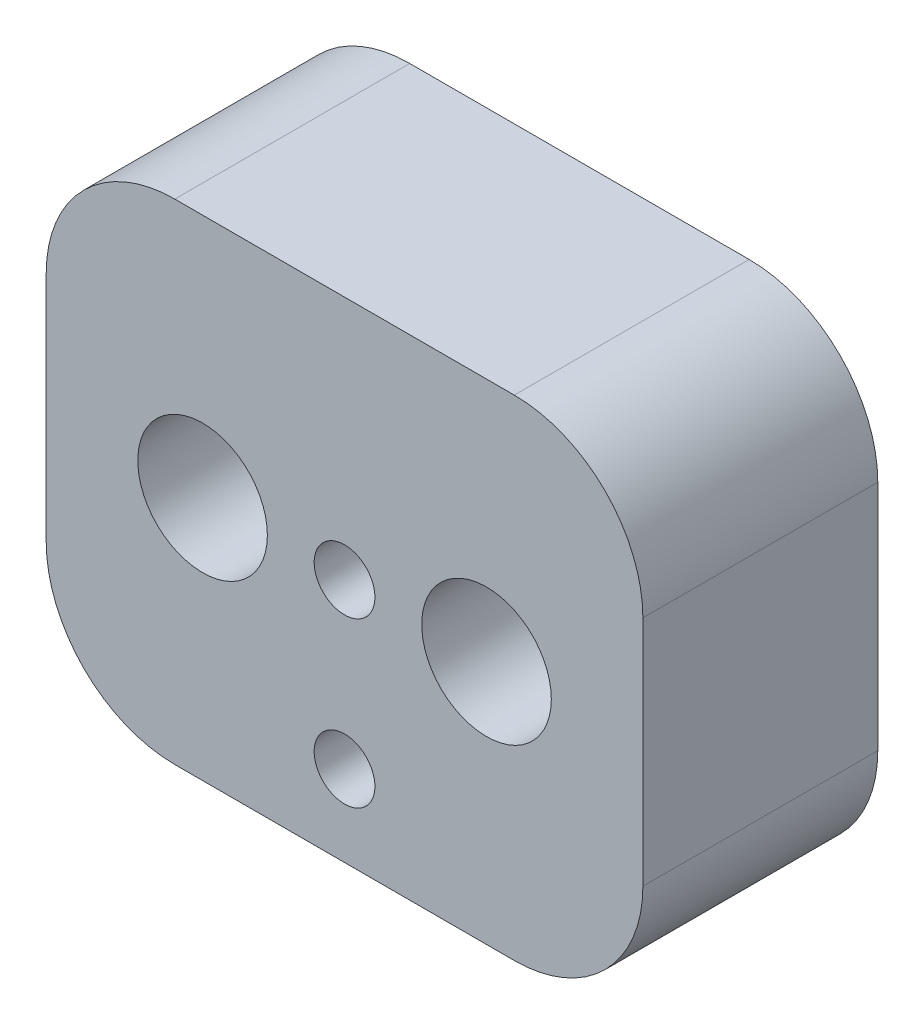
ISO-10303-21;
HEADER;
FILE_DESCRIPTION(('STEP AP214'),'2;1');
FILE_NAME('part.step','',(''),(''),'','','');
FILE_SCHEMA(('AUTOMOTIVE_DESIGN { 1 0 10303 214 1 1 1 1 }'));
ENDSEC;
DATA;
#1=APPLICATION_CONTEXT('core data for automotive mechanical design processes');
#2=APPLICATION_PROTOCOL_DEFINITION('international standard','automotive_design',2000,#1);
#3=PRODUCT_CONTEXT('',#1,'mechanical');
#4=PRODUCT('Part','Part','',(#3));
#5=PRODUCT_RELATED_PRODUCT_CATEGORY('part','',(#4));
#6=PRODUCT_DEFINITION_FORMATION('','',#4);
#7=PRODUCT_DEFINITION_CONTEXT('part definition',#1,'design');
#8=PRODUCT_DEFINITION('design','',#6,#7);
#9=PRODUCT_DEFINITION_SHAPE('','',#8);
#10=(LENGTH_UNIT() NAMED_UNIT(*) SI_UNIT(.MILLI.,.METRE.));
#11=(NAMED_UNIT(*) PLANE_ANGLE_UNIT() SI_UNIT($,.RADIAN.));
#12=(NAMED_UNIT(*) SI_UNIT($,.STERADIAN.) SOLID_ANGLE_UNIT());
#13=UNCERTAINTY_MEASURE_WITH_UNIT(LENGTH_MEASURE(1.E-05),#10,'distance_accuracy_value','');
#14=(GEOMETRIC_REPRESENTATION_CONTEXT(3) GLOBAL_UNCERTAINTY_ASSIGNED_CONTEXT((#13)) GLOBAL_UNIT_ASSIGNED_CONTEXT((#10,
#11,#12)) REPRESENTATION_CONTEXT('',''));
#15=CARTESIAN_POINT('',(0.,0.,0.));
#16=DIRECTION('',(0.,0.,1.));
#17=DIRECTION('',(1.,0.,0.));
#18=AXIS2_PLACEMENT_3D('',#15,#16,#17);
#19=CARTESIAN_POINT('',(0.,0.,5.8));
#20=DIRECTION('',(1.,0.,0.));
#21=DIRECTION('',(0.,0.,-1.));
#22=AXIS2_PLACEMENT_3D('',#19,#20,#21);
#23=PLANE('',#22);
#24=DIRECTION('',(0.,-1.,0.));
#25=VECTOR('',#24,1.);
#26=CARTESIAN_POINT('',(0.,0.,0.));
#27=LINE('',#26,#25);
#28=CARTESIAN_POINT('',(0.,8.9154,0.));
#29=VERTEX_POINT('',#28);
#30=CARTESIAN_POINT('',(0.,3.175,0.));
#31=VERTEX_POINT('',#30);
#32=EDGE_CURVE('E125',#29,#31,#27,.T.);
#33=ORIENTED_EDGE('',*,*,#32,.T.);
#34=DIRECTION('',(0.,0.,-1.));
#35=VECTOR('',#34,1.);
#36=CARTESIAN_POINT('',(0.,3.175,5.8));
#37=LINE('',#36,#35);
#38=CARTESIAN_POINT('',(0.,3.175,5.8));
#39=VERTEX_POINT('',#38);
#40=EDGE_CURVE('E103',#31,#39,#37,.F.);
#41=ORIENTED_EDGE('',*,*,#40,.T.);
#42=DIRECTION('',(0.,-1.,0.));
#43=VECTOR('',#42,1.);
#44=CARTESIAN_POINT('',(0.,0.,5.8));
#45=LINE('',#44,#43);
#46=CARTESIAN_POINT('',(0.,8.9154,5.8));
#47=VERTEX_POINT('',#46);
#48=EDGE_CURVE('E135',#47,#39,#45,.T.);
#49=ORIENTED_EDGE('',*,*,#48,.F.);
#50=DIRECTION('',(0.,0.,-1.));
#51=VECTOR('',#50,1.);
#52=CARTESIAN_POINT('',(0.,8.9154,5.8));
#53=LINE('',#52,#51);
#54=EDGE_CURVE('E108',#47,#29,#53,.T.);
#55=ORIENTED_EDGE('',*,*,#54,.T.);
#56=EDGE_LOOP('',(#33,#41,#49,#55));
#57=FACE_BOUND('',#56,.T.);
#58=ADVANCED_FACE('F32',(#57),#23,.F.);
#59=CARTESIAN_POINT('',(0.,0.,5.8));
#60=DIRECTION('',(0.,1.,0.));
#61=DIRECTION('',(0.,0.,1.));
#62=AXIS2_PLACEMENT_3D('',#59,#60,#61);
#63=PLANE('',#62);
#64=DIRECTION('',(1.,0.,0.));
#65=VECTOR('',#64,1.);
#66=CARTESIAN_POINT('',(0.,0.,5.8));
#67=LINE('',#66,#65);
#68=CARTESIAN_POINT('',(3.175,0.,5.8));
#69=VERTEX_POINT('',#68);
#70=CARTESIAN_POINT('',(11.557,0.,5.8));
#71=VERTEX_POINT('',#70);
#72=EDGE_CURVE('E118',#69,#71,#67,.T.);
#73=ORIENTED_EDGE('',*,*,#72,.F.);
#74=DIRECTION('',(0.,0.,-1.));
#75=VECTOR('',#74,1.);
#76=CARTESIAN_POINT('',(3.175,0.,5.8));
#77=LINE('',#76,#75);
#78=CARTESIAN_POINT('',(3.175,0.,0.));
#79=VERTEX_POINT('',#78);
#80=EDGE_CURVE('E102',#69,#79,#77,.T.);
#81=ORIENTED_EDGE('',*,*,#80,.T.);
#82=DIRECTION('',(1.,0.,0.));
#83=VECTOR('',#82,1.);
#84=CARTESIAN_POINT('',(0.,0.,0.));
#85=LINE('',#84,#83);
#86=CARTESIAN_POINT('',(11.557,0.,0.));
#87=VERTEX_POINT('',#86);
#88=EDGE_CURVE('E115',#79,#87,#85,.T.);
#89=ORIENTED_EDGE('',*,*,#88,.T.);
#90=DIRECTION('',(0.,0.,-1.));
#91=VECTOR('',#90,1.);
#92=CARTESIAN_POINT('',(11.557,0.,5.8));
#93=LINE('',#92,#91);
#94=EDGE_CURVE('E120',#87,#71,#93,.F.);
#95=ORIENTED_EDGE('',*,*,#94,.T.);
#96=EDGE_LOOP('',(#73,#81,#89,#95));
#97=FACE_BOUND('',#96,.T.);
#98=ADVANCED_FACE('F114',(#97),#63,.F.);
#99=CARTESIAN_POINT('',(14.732,0.,5.8));
#100=DIRECTION('',(-1.,0.,0.));
#101=DIRECTION('',(0.,-1.,0.));
#102=AXIS2_PLACEMENT_3D('',#99,#100,#101);
#103=PLANE('',#102);
#104=DIRECTION('',(0.,1.,0.));
#105=VECTOR('',#104,1.);
#106=CARTESIAN_POINT('',(14.732,0.,5.8));
#107=LINE('',#106,#105);
#108=CARTESIAN_POINT('',(14.732,3.175,5.8));
#109=VERTEX_POINT('',#108);
#110=CARTESIAN_POINT('',(14.732,8.9154,5.8));
#111=VERTEX_POINT('',#110);
#112=EDGE_CURVE('E170',#109,#111,#107,.T.);
#113=ORIENTED_EDGE('',*,*,#112,.F.);
#114=DIRECTION('',(0.,0.,-1.));
#115=VECTOR('',#114,1.);
#116=CARTESIAN_POINT('',(14.732,3.175,5.8));
#117=LINE('',#116,#115);
#118=CARTESIAN_POINT('',(14.732,3.175,0.));
#119=VERTEX_POINT('',#118);
#120=EDGE_CURVE('E163',#109,#119,#117,.T.);
#121=ORIENTED_EDGE('',*,*,#120,.T.);
#122=DIRECTION('',(0.,1.,0.));
#123=VECTOR('',#122,1.);
#124=CARTESIAN_POINT('',(14.732,0.,0.));
#125=LINE('',#124,#123);
#126=CARTESIAN_POINT('',(14.732,8.9154,0.));
#127=VERTEX_POINT('',#126);
#128=EDGE_CURVE('E124',#119,#127,#125,.T.);
#129=ORIENTED_EDGE('',*,*,#128,.T.);
#130=DIRECTION('',(0.,0.,-1.));
#131=VECTOR('',#130,1.);
#132=CARTESIAN_POINT('',(14.732,8.9154,5.8));
#133=LINE('',#132,#131);
#134=EDGE_CURVE('E161',#127,#111,#133,.F.);
#135=ORIENTED_EDGE('',*,*,#134,.T.);
#136=EDGE_LOOP('',(#113,#121,#129,#135));
#137=FACE_BOUND('',#136,.T.);
#138=ADVANCED_FACE('F168',(#137),#103,.F.);
#139=CARTESIAN_POINT('',(0.,12.0904,5.8));
#140=DIRECTION('',(0.,-1.,0.));
#141=DIRECTION('',(0.,0.,-1.));
#142=AXIS2_PLACEMENT_3D('',#139,#140,#141);
#143=PLANE('',#142);
#144=DIRECTION('',(-1.,0.,0.));
#145=VECTOR('',#144,1.);
#146=CARTESIAN_POINT('',(0.,12.0904,5.8));
#147=LINE('',#146,#145);
#148=CARTESIAN_POINT('',(11.557,12.0904,5.8));
#149=VERTEX_POINT('',#148);
#150=CARTESIAN_POINT('',(3.175,12.0904,5.8));
#151=VERTEX_POINT('',#150);
#152=EDGE_CURVE('E145',#149,#151,#147,.T.);
#153=ORIENTED_EDGE('',*,*,#152,.F.);
#154=DIRECTION('',(0.,0.,-1.));
#155=VECTOR('',#154,1.);
#156=CARTESIAN_POINT('',(11.557,12.0904,5.8));
#157=LINE('',#156,#155);
#158=CARTESIAN_POINT('',(11.557,12.0904,0.));
#159=VERTEX_POINT('',#158);
#160=EDGE_CURVE('E11',#149,#159,#157,.T.);
#161=ORIENTED_EDGE('',*,*,#160,.T.);
#162=DIRECTION('',(-1.,0.,0.));
#163=VECTOR('',#162,1.);
#164=CARTESIAN_POINT('',(0.,12.0904,0.));
#165=LINE('',#164,#163);
#166=CARTESIAN_POINT('',(3.175,12.0904,0.));
#167=VERTEX_POINT('',#166);
#168=EDGE_CURVE('E128',#159,#167,#165,.T.);
#169=ORIENTED_EDGE('',*,*,#168,.T.);
#170=DIRECTION('',(0.,0.,-1.));
#171=VECTOR('',#170,1.);
#172=CARTESIAN_POINT('',(3.175,12.0904,5.8));
#173=LINE('',#172,#171);
#174=EDGE_CURVE('E40',#167,#151,#173,.F.);
#175=ORIENTED_EDGE('',*,*,#174,.T.);
#176=EDGE_LOOP('',(#153,#161,#169,#175));
#177=FACE_BOUND('',#176,.T.);
#178=ADVANCED_FACE('F177',(#177),#143,.F.);
#179=CARTESIAN_POINT('',(0.,12.0904,5.8));
#180=DIRECTION('',(0.,0.,-1.));
#181=DIRECTION('',(-1.,0.,0.));
#182=AXIS2_PLACEMENT_3D('',#179,#180,#181);
#183=PLANE('',#182);
#184=CARTESIAN_POINT('',(3.8608,6.0452,5.8));
#185=DIRECTION('',(0.,0.,1.));
#186=DIRECTION('',(1.,0.,0.));
#187=AXIS2_PLACEMENT_3D('',#184,#185,#186);
#188=CIRCLE('',#187,1.59999999999999);
#189=CARTESIAN_POINT('',(5.46079999999999,6.0452,5.8));
#190=VERTEX_POINT('',#189);
#191=EDGE_CURVE('E144',#190,#190,#188,.T.);
#192=ORIENTED_EDGE('',*,*,#191,.F.);
#193=EDGE_LOOP('',(#192));
#194=FACE_BOUND('',#193,.T.);
#195=CARTESIAN_POINT('',(10.8712,6.0452,5.8));
#196=DIRECTION('',(0.,0.,1.));
#197=DIRECTION('',(1.,0.,0.));
#198=AXIS2_PLACEMENT_3D('',#195,#196,#197);
#199=CIRCLE('',#198,1.59999999999999);
#200=CARTESIAN_POINT('',(12.4712,6.0452,5.8));
#201=VERTEX_POINT('',#200);
#202=EDGE_CURVE('E140',#201,#201,#199,.T.);
#203=ORIENTED_EDGE('',*,*,#202,.F.);
#204=EDGE_LOOP('',(#203));
#205=FACE_BOUND('',#204,.T.);
#206=CARTESIAN_POINT('',(7.366,2.,5.8));
#207=DIRECTION('',(0.,0.,1.));
#208=DIRECTION('',(1.,0.,0.));
#209=AXIS2_PLACEMENT_3D('',#206,#207,#208);
#210=CIRCLE('',#209,0.749999999999999);
#211=CARTESIAN_POINT('',(8.116,2.,5.8));
#212=VERTEX_POINT('',#211);
#213=EDGE_CURVE('E139',#212,#212,#210,.T.);
#214=ORIENTED_EDGE('',*,*,#213,.F.);
#215=EDGE_LOOP('',(#214));
#216=FACE_BOUND('',#215,.T.);
#217=CARTESIAN_POINT('',(7.366,6.0452,5.8));
#218=DIRECTION('',(0.,0.,1.));
#219=DIRECTION('',(1.,0.,0.));
#220=AXIS2_PLACEMENT_3D('',#217,#218,#219);
#221=CIRCLE('',#220,0.749999999999998);
#222=CARTESIAN_POINT('',(8.11599999999999,6.0452,5.8));
#223=VERTEX_POINT('',#222);
#224=EDGE_CURVE('E184',#223,#223,#221,.T.);
#225=ORIENTED_EDGE('',*,*,#224,.F.);
#226=EDGE_LOOP('',(#225));
#227=FACE_BOUND('',#226,.T.);
#228=ORIENTED_EDGE('',*,*,#48,.T.);
#229=CARTESIAN_POINT('',(3.175,3.175,5.8));
#230=DIRECTION('',(0.,0.,-1.));
#231=DIRECTION('',(-1.,0.,0.));
#232=AXIS2_PLACEMENT_3D('',#229,#230,#231);
#233=CIRCLE('',#232,3.175);
#234=EDGE_CURVE('E159',#39,#69,#233,.F.);
#235=ORIENTED_EDGE('',*,*,#234,.T.);
#236=ORIENTED_EDGE('',*,*,#72,.T.);
#237=CARTESIAN_POINT('',(11.557,3.175,5.8));
#238=DIRECTION('',(0.,0.,-1.));
#239=DIRECTION('',(-1.,0.,0.));
#240=AXIS2_PLACEMENT_3D('',#237,#238,#239);
#241=CIRCLE('',#240,3.175);
#242=EDGE_CURVE('E157',#71,#109,#241,.F.);
#243=ORIENTED_EDGE('',*,*,#242,.T.);
#244=ORIENTED_EDGE('',*,*,#112,.T.);
#245=CARTESIAN_POINT('',(11.557,8.9154,5.8));
#246=DIRECTION('',(0.,0.,-1.));
#247=DIRECTION('',(-1.,0.,0.));
#248=AXIS2_PLACEMENT_3D('',#245,#246,#247);
#249=CIRCLE('',#248,3.175);
#250=EDGE_CURVE('E53',#111,#149,#249,.F.);
#251=ORIENTED_EDGE('',*,*,#250,.T.);
#252=ORIENTED_EDGE('',*,*,#152,.T.);
#253=CARTESIAN_POINT('',(3.175,8.9154,5.8));
#254=DIRECTION('',(0.,0.,-1.));
#255=DIRECTION('',(-1.,0.,0.));
#256=AXIS2_PLACEMENT_3D('',#253,#254,#255);
#257=CIRCLE('',#256,3.175);
#258=EDGE_CURVE('E154',#151,#47,#257,.F.);
#259=ORIENTED_EDGE('',*,*,#258,.T.);
#260=EDGE_LOOP('',(#228,#235,#236,#243,#244,#251,#252,#259));
#261=FACE_BOUND('',#260,.T.);
#262=ADVANCED_FACE('F201',(#194,#205,#216,#227,#261),#183,.F.);
#263=CARTESIAN_POINT('',(0.,12.0904,0.));
#264=DIRECTION('',(0.,0.,-1.));
#265=DIRECTION('',(-1.,0.,0.));
#266=AXIS2_PLACEMENT_3D('',#263,#264,#265);
#267=PLANE('',#266);
#268=CARTESIAN_POINT('',(3.8608,6.0452,0.));
#269=DIRECTION('',(0.,0.,-1.));
#270=DIRECTION('',(-1.,0.,0.));
#271=AXIS2_PLACEMENT_3D('',#268,#269,#270);
#272=CIRCLE('',#271,1.59999999999999);
#273=CARTESIAN_POINT('',(2.26080000000001,6.0452,0.));
#274=VERTEX_POINT('',#273);
#275=EDGE_CURVE('E141',#274,#274,#272,.T.);
#276=ORIENTED_EDGE('',*,*,#275,.F.);
#277=EDGE_LOOP('',(#276));
#278=FACE_BOUND('',#277,.T.);
#279=CARTESIAN_POINT('',(10.8712,6.0452,0.));
#280=DIRECTION('',(0.,0.,-1.));
#281=DIRECTION('',(-1.,0.,0.));
#282=AXIS2_PLACEMENT_3D('',#279,#280,#281);
#283=CIRCLE('',#282,1.59999999999999);
#284=CARTESIAN_POINT('',(9.27120000000001,6.0452,0.));
#285=VERTEX_POINT('',#284);
#286=EDGE_CURVE('E136',#285,#285,#283,.T.);
#287=ORIENTED_EDGE('',*,*,#286,.F.);
#288=EDGE_LOOP('',(#287));
#289=FACE_BOUND('',#288,.T.);
#290=CARTESIAN_POINT('',(7.366,2.,0.));
#291=DIRECTION('',(0.,0.,1.));
#292=DIRECTION('',(1.,0.,0.));
#293=AXIS2_PLACEMENT_3D('',#290,#291,#292);
#294=CIRCLE('',#293,0.749999999999999);
#295=CARTESIAN_POINT('',(8.116,2.,0.));
#296=VERTEX_POINT('',#295);
#297=EDGE_CURVE('E187',#296,#296,#294,.T.);
#298=ORIENTED_EDGE('',*,*,#297,.T.);
#299=EDGE_LOOP('',(#298));
#300=FACE_BOUND('',#299,.T.);
#301=CARTESIAN_POINT('',(7.366,6.0452,0.));
#302=DIRECTION('',(0.,0.,1.));
#303=DIRECTION('',(1.,0.,0.));
#304=AXIS2_PLACEMENT_3D('',#301,#302,#303);
#305=CIRCLE('',#304,0.749999999999998);
#306=CARTESIAN_POINT('',(8.11599999999999,6.0452,0.));
#307=VERTEX_POINT('',#306);
#308=EDGE_CURVE('E130',#307,#307,#305,.T.);
#309=ORIENTED_EDGE('',*,*,#308,.T.);
#310=EDGE_LOOP('',(#309));
#311=FACE_BOUND('',#310,.T.);
#312=ORIENTED_EDGE('',*,*,#88,.F.);
#313=CARTESIAN_POINT('',(3.175,3.175,0.));
#314=DIRECTION('',(0.,0.,-1.));
#315=DIRECTION('',(-1.,0.,0.));
#316=AXIS2_PLACEMENT_3D('',#313,#314,#315);
#317=CIRCLE('',#316,3.175);
#318=EDGE_CURVE('E98',#79,#31,#317,.T.);
#319=ORIENTED_EDGE('',*,*,#318,.T.);
#320=ORIENTED_EDGE('',*,*,#32,.F.);
#321=CARTESIAN_POINT('',(3.175,8.9154,0.));
#322=DIRECTION('',(0.,0.,-1.));
#323=DIRECTION('',(-1.,0.,0.));
#324=AXIS2_PLACEMENT_3D('',#321,#322,#323);
#325=CIRCLE('',#324,3.175);
#326=EDGE_CURVE('E119',#29,#167,#325,.T.);
#327=ORIENTED_EDGE('',*,*,#326,.T.);
#328=ORIENTED_EDGE('',*,*,#168,.F.);
#329=CARTESIAN_POINT('',(11.557,8.9154,0.));
#330=DIRECTION('',(0.,0.,-1.));
#331=DIRECTION('',(-1.,0.,0.));
#332=AXIS2_PLACEMENT_3D('',#329,#330,#331);
#333=CIRCLE('',#332,3.175);
#334=EDGE_CURVE('E148',#159,#127,#333,.T.);
#335=ORIENTED_EDGE('',*,*,#334,.T.);
#336=ORIENTED_EDGE('',*,*,#128,.F.);
#337=CARTESIAN_POINT('',(11.557,3.175,0.));
#338=DIRECTION('',(0.,0.,-1.));
#339=DIRECTION('',(-1.,0.,0.));
#340=AXIS2_PLACEMENT_3D('',#337,#338,#339);
#341=CIRCLE('',#340,3.175);
#342=EDGE_CURVE('E109',#119,#87,#341,.T.);
#343=ORIENTED_EDGE('',*,*,#342,.T.);
#344=EDGE_LOOP('',(#312,#319,#320,#327,#328,#335,#336,#343));
#345=FACE_BOUND('',#344,.T.);
#346=ADVANCED_FACE('F122',(#278,#289,#300,#311,#345),#267,.T.);
#347=CARTESIAN_POINT('',(7.366,6.0452,0.));
#348=DIRECTION('',(0.,0.,1.));
#349=DIRECTION('',(1.,0.,0.));
#350=AXIS2_PLACEMENT_3D('',#347,#348,#349);
#351=CYLINDRICAL_SURFACE('',#350,0.749999999999998);
#352=ORIENTED_EDGE('',*,*,#308,.F.);
#353=EDGE_LOOP('',(#352));
#354=FACE_BOUND('',#353,.T.);
#355=ORIENTED_EDGE('',*,*,#224,.T.);
#356=EDGE_LOOP('',(#355));
#357=FACE_BOUND('',#356,.T.);
#358=ADVANCED_FACE('F277',(#354,#357),#351,.F.);
#359=CARTESIAN_POINT('',(7.366,2.,0.));
#360=DIRECTION('',(0.,0.,1.));
#361=DIRECTION('',(1.,0.,0.));
#362=AXIS2_PLACEMENT_3D('',#359,#360,#361);
#363=CYLINDRICAL_SURFACE('',#362,0.749999999999999);
#364=ORIENTED_EDGE('',*,*,#297,.F.);
#365=EDGE_LOOP('',(#364));
#366=FACE_BOUND('',#365,.T.);
#367=ORIENTED_EDGE('',*,*,#213,.T.);
#368=EDGE_LOOP('',(#367));
#369=FACE_BOUND('',#368,.T.);
#370=ADVANCED_FACE('F268',(#366,#369),#363,.F.);
#371=CARTESIAN_POINT('',(10.8712,6.0452,5.8));
#372=DIRECTION('',(0.,0.,1.));
#373=DIRECTION('',(1.,0.,0.));
#374=AXIS2_PLACEMENT_3D('',#371,#372,#373);
#375=CYLINDRICAL_SURFACE('',#374,1.59999999999999);
#376=ORIENTED_EDGE('',*,*,#286,.T.);
#377=EDGE_LOOP('',(#376));
#378=FACE_BOUND('',#377,.T.);
#379=ORIENTED_EDGE('',*,*,#202,.T.);
#380=EDGE_LOOP('',(#379));
#381=FACE_BOUND('',#380,.T.);
#382=ADVANCED_FACE('F259',(#378,#381),#375,.F.);
#383=CARTESIAN_POINT('',(3.8608,6.0452,5.8));
#384=DIRECTION('',(0.,0.,1.));
#385=DIRECTION('',(1.,0.,0.));
#386=AXIS2_PLACEMENT_3D('',#383,#384,#385);
#387=CYLINDRICAL_SURFACE('',#386,1.59999999999999);
#388=ORIENTED_EDGE('',*,*,#275,.T.);
#389=EDGE_LOOP('',(#388));
#390=FACE_BOUND('',#389,.T.);
#391=ORIENTED_EDGE('',*,*,#191,.T.);
#392=EDGE_LOOP('',(#391));
#393=FACE_BOUND('',#392,.T.);
#394=ADVANCED_FACE('F199',(#390,#393),#387,.F.);
#395=CARTESIAN_POINT('',(3.175,3.175,5.8));
#396=DIRECTION('',(0.,0.,-1.));
#397=DIRECTION('',(-1.,0.,0.));
#398=AXIS2_PLACEMENT_3D('',#395,#396,#397);
#399=CYLINDRICAL_SURFACE('',#398,3.175);
#400=ORIENTED_EDGE('',*,*,#234,.F.);
#401=ORIENTED_EDGE('',*,*,#40,.F.);
#402=ORIENTED_EDGE('',*,*,#318,.F.);
#403=ORIENTED_EDGE('',*,*,#80,.F.);
#404=EDGE_LOOP('',(#400,#401,#402,#403));
#405=FACE_BOUND('',#404,.T.);
#406=ADVANCED_FACE('F101',(#405),#399,.T.);
#407=CARTESIAN_POINT('',(11.557,3.175,5.8));
#408=DIRECTION('',(0.,0.,-1.));
#409=DIRECTION('',(-1.,0.,0.));
#410=AXIS2_PLACEMENT_3D('',#407,#408,#409);
#411=CYLINDRICAL_SURFACE('',#410,3.175);
#412=ORIENTED_EDGE('',*,*,#242,.F.);
#413=ORIENTED_EDGE('',*,*,#94,.F.);
#414=ORIENTED_EDGE('',*,*,#342,.F.);
#415=ORIENTED_EDGE('',*,*,#120,.F.);
#416=EDGE_LOOP('',(#412,#413,#414,#415));
#417=FACE_BOUND('',#416,.T.);
#418=ADVANCED_FACE('F218',(#417),#411,.T.);
#419=CARTESIAN_POINT('',(11.557,8.9154,5.8));
#420=DIRECTION('',(0.,0.,-1.));
#421=DIRECTION('',(-1.,0.,0.));
#422=AXIS2_PLACEMENT_3D('',#419,#420,#421);
#423=CYLINDRICAL_SURFACE('',#422,3.175);
#424=ORIENTED_EDGE('',*,*,#250,.F.);
#425=ORIENTED_EDGE('',*,*,#134,.F.);
#426=ORIENTED_EDGE('',*,*,#334,.F.);
#427=ORIENTED_EDGE('',*,*,#160,.F.);
#428=EDGE_LOOP('',(#424,#425,#426,#427));
#429=FACE_BOUND('',#428,.T.);
#430=ADVANCED_FACE('F176',(#429),#423,.T.);
#431=CARTESIAN_POINT('',(3.175,8.9154,5.8));
#432=DIRECTION('',(0.,0.,-1.));
#433=DIRECTION('',(-1.,0.,0.));
#434=AXIS2_PLACEMENT_3D('',#431,#432,#433);
#435=CYLINDRICAL_SURFACE('',#434,3.175);
#436=ORIENTED_EDGE('',*,*,#258,.F.);
#437=ORIENTED_EDGE('',*,*,#174,.F.);
#438=ORIENTED_EDGE('',*,*,#326,.F.);
#439=ORIENTED_EDGE('',*,*,#54,.F.);
#440=EDGE_LOOP('',(#436,#437,#438,#439));
#441=FACE_BOUND('',#440,.T.);
#442=ADVANCED_FACE('F34',(#441),#435,.T.);
#443=CLOSED_SHELL('',(#58,#98,#138,#178,#262,#346,#358,#370,#382,#394,#406,#418,#430,#442));
#444=MANIFOLD_SOLID_BREP('B2',#443);
#445=ADVANCED_BREP_SHAPE_REPRESENTATION('',(#18,#444),#14);
#446=SHAPE_DEFINITION_REPRESENTATION(#9,#445);
ENDSEC;
END-ISO-10303-21;
